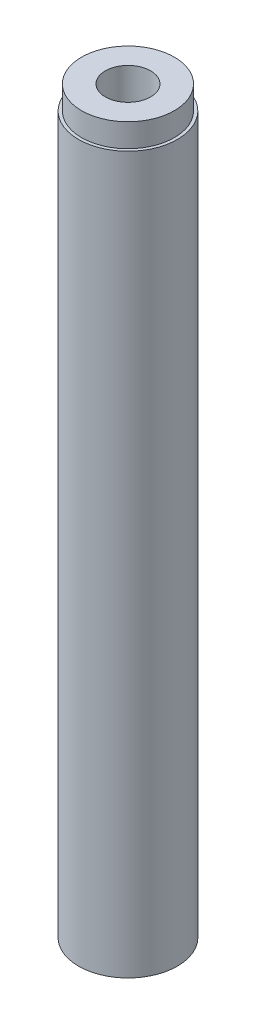
ISO-10303-21;
HEADER;
FILE_DESCRIPTION(('STEP AP214'),'2;1');
FILE_NAME('part.step','',(''),(''),'','','');
FILE_SCHEMA(('AUTOMOTIVE_DESIGN { 1 0 10303 214 1 1 1 1 }'));
ENDSEC;
DATA;
#1=APPLICATION_CONTEXT('core data for automotive mechanical design processes');
#2=APPLICATION_PROTOCOL_DEFINITION('international standard','automotive_design',2000,#1);
#3=PRODUCT_CONTEXT('',#1,'mechanical');
#4=PRODUCT('Part','Part','',(#3));
#5=PRODUCT_RELATED_PRODUCT_CATEGORY('part','',(#4));
#6=PRODUCT_DEFINITION_FORMATION('','',#4);
#7=PRODUCT_DEFINITION_CONTEXT('part definition',#1,'design');
#8=PRODUCT_DEFINITION('design','',#6,#7);
#9=PRODUCT_DEFINITION_SHAPE('','',#8);
#10=(LENGTH_UNIT() NAMED_UNIT(*) SI_UNIT(.MILLI.,.METRE.));
#11=(NAMED_UNIT(*) PLANE_ANGLE_UNIT() SI_UNIT($,.RADIAN.));
#12=(NAMED_UNIT(*) SI_UNIT($,.STERADIAN.) SOLID_ANGLE_UNIT());
#13=UNCERTAINTY_MEASURE_WITH_UNIT(LENGTH_MEASURE(1.E-05),#10,'distance_accuracy_value','');
#14=(GEOMETRIC_REPRESENTATION_CONTEXT(3) GLOBAL_UNCERTAINTY_ASSIGNED_CONTEXT((#13)) GLOBAL_UNIT_ASSIGNED_CONTEXT((#10,
#11,#12)) REPRESENTATION_CONTEXT('',''));
#15=CARTESIAN_POINT('',(0.,0.,0.));
#16=DIRECTION('',(0.,0.,1.));
#17=DIRECTION('',(1.,0.,0.));
#18=AXIS2_PLACEMENT_3D('',#15,#16,#17);
#19=CARTESIAN_POINT('',(0.,98.,0.));
#20=DIRECTION('',(0.,1.,0.));
#21=DIRECTION('',(0.,0.,1.));
#22=AXIS2_PLACEMENT_3D('',#19,#20,#21);
#23=PLANE('',#22);
#24=CARTESIAN_POINT('',(0.,98.,0.));
#25=DIRECTION('',(0.,1.,0.));
#26=DIRECTION('',(0.,0.,1.));
#27=AXIS2_PLACEMENT_3D('',#24,#25,#26);
#28=CIRCLE('',#27,3.);
#29=CARTESIAN_POINT('',(0.,98.,3.));
#30=VERTEX_POINT('',#29);
#31=EDGE_CURVE('E45',#30,#30,#28,.T.);
#32=ORIENTED_EDGE('',*,*,#31,.F.);
#33=EDGE_LOOP('',(#32));
#34=FACE_BOUND('',#33,.T.);
#35=CARTESIAN_POINT('',(0.,98.,0.));
#36=DIRECTION('',(0.,1.,0.));
#37=DIRECTION('',(0.,0.,1.));
#38=AXIS2_PLACEMENT_3D('',#35,#36,#37);
#39=CIRCLE('',#38,6.15);
#40=CARTESIAN_POINT('',(0.,98.,6.15));
#41=VERTEX_POINT('',#40);
#42=EDGE_CURVE('E59',#41,#41,#39,.T.);
#43=ORIENTED_EDGE('',*,*,#42,.T.);
#44=EDGE_LOOP('',(#43));
#45=FACE_BOUND('',#44,.T.);
#46=ADVANCED_FACE('F38',(#34,#45),#23,.T.);
#47=CARTESIAN_POINT('',(0.,98.,0.));
#48=DIRECTION('',(0.,-1.,0.));
#49=DIRECTION('',(0.,0.,-1.));
#50=AXIS2_PLACEMENT_3D('',#47,#48,#49);
#51=CYLINDRICAL_SURFACE('',#50,6.55);
#52=CARTESIAN_POINT('',(0.,0.,0.));
#53=DIRECTION('',(0.,1.,0.));
#54=DIRECTION('',(0.,0.,1.));
#55=AXIS2_PLACEMENT_3D('',#52,#53,#54);
#56=CIRCLE('',#55,6.55);
#57=CARTESIAN_POINT('',(0.,0.,6.55));
#58=VERTEX_POINT('',#57);
#59=EDGE_CURVE('E11',#58,#58,#56,.T.);
#60=ORIENTED_EDGE('',*,*,#59,.T.);
#61=EDGE_LOOP('',(#60));
#62=FACE_BOUND('',#61,.T.);
#63=CARTESIAN_POINT('',(0.,94.9,0.));
#64=DIRECTION('',(0.,1.,0.));
#65=DIRECTION('',(0.,0.,1.));
#66=AXIS2_PLACEMENT_3D('',#63,#64,#65);
#67=CIRCLE('',#66,6.55);
#68=CARTESIAN_POINT('',(0.,94.9,6.55));
#69=VERTEX_POINT('',#68);
#70=EDGE_CURVE('E54',#69,#69,#67,.T.);
#71=ORIENTED_EDGE('',*,*,#70,.F.);
#72=EDGE_LOOP('',(#71));
#73=FACE_BOUND('',#72,.T.);
#74=ADVANCED_FACE('F40',(#62,#73),#51,.T.);
#75=CARTESIAN_POINT('',(0.,0.,0.));
#76=DIRECTION('',(0.,1.,0.));
#77=DIRECTION('',(0.,0.,1.));
#78=AXIS2_PLACEMENT_3D('',#75,#76,#77);
#79=PLANE('',#78);
#80=ORIENTED_EDGE('',*,*,#59,.F.);
#81=EDGE_LOOP('',(#80));
#82=FACE_BOUND('',#81,.T.);
#83=CARTESIAN_POINT('',(0.,0.,0.));
#84=DIRECTION('',(0.,1.,0.));
#85=DIRECTION('',(0.,0.,1.));
#86=AXIS2_PLACEMENT_3D('',#83,#84,#85);
#87=CIRCLE('',#86,3.);
#88=CARTESIAN_POINT('',(0.,0.,3.));
#89=VERTEX_POINT('',#88);
#90=EDGE_CURVE('E49',#89,#89,#87,.T.);
#91=ORIENTED_EDGE('',*,*,#90,.T.);
#92=EDGE_LOOP('',(#91));
#93=FACE_BOUND('',#92,.T.);
#94=ADVANCED_FACE('F76',(#82,#93),#79,.F.);
#95=CARTESIAN_POINT('',(0.,98.,0.));
#96=DIRECTION('',(0.,-1.,0.));
#97=DIRECTION('',(0.,0.,-1.));
#98=AXIS2_PLACEMENT_3D('',#95,#96,#97);
#99=CYLINDRICAL_SURFACE('',#98,3.);
#100=ORIENTED_EDGE('',*,*,#31,.T.);
#101=EDGE_LOOP('',(#100));
#102=FACE_BOUND('',#101,.T.);
#103=ORIENTED_EDGE('',*,*,#90,.F.);
#104=EDGE_LOOP('',(#103));
#105=FACE_BOUND('',#104,.T.);
#106=ADVANCED_FACE('F71',(#102,#105),#99,.F.);
#107=CARTESIAN_POINT('',(0.,94.9,0.));
#108=DIRECTION('',(0.,1.,0.));
#109=DIRECTION('',(0.,0.,1.));
#110=AXIS2_PLACEMENT_3D('',#107,#108,#109);
#111=PLANE('',#110);
#112=CARTESIAN_POINT('',(0.,94.9,0.));
#113=DIRECTION('',(0.,1.,0.));
#114=DIRECTION('',(0.,0.,1.));
#115=AXIS2_PLACEMENT_3D('',#112,#113,#114);
#116=CIRCLE('',#115,6.15);
#117=CARTESIAN_POINT('',(0.,94.9,6.15));
#118=VERTEX_POINT('',#117);
#119=EDGE_CURVE('E58',#118,#118,#116,.T.);
#120=ORIENTED_EDGE('',*,*,#119,.F.);
#121=EDGE_LOOP('',(#120));
#122=FACE_BOUND('',#121,.T.);
#123=ORIENTED_EDGE('',*,*,#70,.T.);
#124=EDGE_LOOP('',(#123));
#125=FACE_BOUND('',#124,.T.);
#126=ADVANCED_FACE('F68',(#122,#125),#111,.T.);
#127=CARTESIAN_POINT('',(0.,94.9,0.));
#128=DIRECTION('',(0.,1.,0.));
#129=DIRECTION('',(0.,0.,1.));
#130=AXIS2_PLACEMENT_3D('',#127,#128,#129);
#131=CYLINDRICAL_SURFACE('',#130,6.15);
#132=CARTESIAN_POINT('',(0.,94.9,6.15));
#133=CARTESIAN_POINT('',(0.,94.9322916666667,6.15));
#134=CARTESIAN_POINT('',(0.,94.9645833333333,6.15));
#135=CARTESIAN_POINT('',(0.,95.0291666666667,6.15));
#136=CARTESIAN_POINT('',(0.,95.0614583333333,6.15));
#137=CARTESIAN_POINT('',(0.,95.1260416666667,6.15));
#138=CARTESIAN_POINT('',(0.,95.1583333333333,6.15));
#139=CARTESIAN_POINT('',(0.,95.2229166666667,6.15));
#140=CARTESIAN_POINT('',(0.,95.2552083333333,6.15));
#141=CARTESIAN_POINT('',(0.,95.3197916666667,6.15));
#142=CARTESIAN_POINT('',(0.,95.3520833333333,6.15));
#143=CARTESIAN_POINT('',(0.,95.4166666666667,6.15));
#144=CARTESIAN_POINT('',(0.,95.4489583333333,6.15));
#145=CARTESIAN_POINT('',(0.,95.5135416666667,6.15));
#146=CARTESIAN_POINT('',(0.,95.5458333333333,6.15));
#147=CARTESIAN_POINT('',(0.,95.6104166666667,6.15));
#148=CARTESIAN_POINT('',(0.,95.6427083333333,6.15));
#149=CARTESIAN_POINT('',(0.,95.7072916666667,6.15));
#150=CARTESIAN_POINT('',(0.,95.7395833333333,6.15));
#151=CARTESIAN_POINT('',(0.,95.8041666666667,6.15));
#152=CARTESIAN_POINT('',(0.,95.8364583333333,6.15));
#153=CARTESIAN_POINT('',(0.,95.9010416666667,6.15));
#154=CARTESIAN_POINT('',(0.,95.9333333333333,6.15));
#155=CARTESIAN_POINT('',(0.,95.9979166666667,6.15));
#156=CARTESIAN_POINT('',(0.,96.0302083333333,6.15));
#157=CARTESIAN_POINT('',(0.,96.0947916666667,6.15));
#158=CARTESIAN_POINT('',(0.,96.1270833333333,6.15));
#159=CARTESIAN_POINT('',(0.,96.1916666666667,6.15));
#160=CARTESIAN_POINT('',(0.,96.2239583333333,6.15));
#161=CARTESIAN_POINT('',(0.,96.2885416666667,6.15));
#162=CARTESIAN_POINT('',(0.,96.3208333333333,6.15));
#163=CARTESIAN_POINT('',(0.,96.3854166666667,6.15));
#164=CARTESIAN_POINT('',(0.,96.4177083333333,6.15));
#165=CARTESIAN_POINT('',(0.,96.4822916666667,6.15));
#166=CARTESIAN_POINT('',(0.,96.5145833333333,6.15));
#167=CARTESIAN_POINT('',(0.,96.5791666666667,6.15));
#168=CARTESIAN_POINT('',(0.,96.6114583333333,6.15));
#169=CARTESIAN_POINT('',(0.,96.6760416666667,6.15));
#170=CARTESIAN_POINT('',(0.,96.7083333333333,6.15));
#171=CARTESIAN_POINT('',(0.,96.7729166666667,6.15));
#172=CARTESIAN_POINT('',(0.,96.8052083333333,6.15));
#173=CARTESIAN_POINT('',(0.,96.8697916666667,6.15));
#174=CARTESIAN_POINT('',(0.,96.9020833333333,6.15));
#175=CARTESIAN_POINT('',(0.,96.9666666666667,6.15));
#176=CARTESIAN_POINT('',(0.,96.9989583333333,6.15));
#177=CARTESIAN_POINT('',(0.,97.0635416666667,6.15));
#178=CARTESIAN_POINT('',(0.,97.0958333333333,6.15));
#179=CARTESIAN_POINT('',(0.,97.1604166666667,6.15));
#180=CARTESIAN_POINT('',(0.,97.1927083333333,6.15));
#181=CARTESIAN_POINT('',(0.,97.2572916666667,6.15));
#182=CARTESIAN_POINT('',(0.,97.2895833333333,6.15));
#183=CARTESIAN_POINT('',(0.,97.3541666666667,6.15));
#184=CARTESIAN_POINT('',(0.,97.3864583333333,6.15));
#185=CARTESIAN_POINT('',(0.,97.4510416666667,6.15));
#186=CARTESIAN_POINT('',(0.,97.4833333333333,6.15));
#187=CARTESIAN_POINT('',(0.,97.5479166666667,6.15));
#188=CARTESIAN_POINT('',(0.,97.5802083333333,6.15));
#189=CARTESIAN_POINT('',(0.,97.6447916666667,6.15));
#190=CARTESIAN_POINT('',(0.,97.6770833333333,6.15));
#191=CARTESIAN_POINT('',(0.,97.7416666666667,6.15));
#192=CARTESIAN_POINT('',(0.,97.7739583333333,6.15));
#193=CARTESIAN_POINT('',(0.,97.8385416666667,6.15));
#194=CARTESIAN_POINT('',(0.,97.8708333333333,6.15));
#195=CARTESIAN_POINT('',(0.,97.9354166666667,6.15));
#196=CARTESIAN_POINT('',(0.,97.9677083333333,6.15));
#197=CARTESIAN_POINT('',(0.,98.,6.15));
#198=B_SPLINE_CURVE_WITH_KNOTS('',3,(#132,#133,#134,#135,#136,#137,#138,#139,#140,#141,#142,
#143,#144,#145,#146,#147,#148,#149,#150,#151,#152,#153,#154,#155,#156,#157,#158,#159,#160,#161,
#162,#163,#164,#165,#166,#167,#168,#169,#170,#171,#172,#173,#174,#175,#176,#177,#178,#179,#180,
#181,#182,#183,#184,#185,#186,#187,#188,#189,#190,#191,#192,#193,#194,#195,#196,#197),
.UNSPECIFIED.,.F.,.F.,(4,2,2,2,2,2,2,2,2,2,2,2,2,2,2,2,2,2,2,2,2,2,2,2,2,2,2,2,2,2,2,2,4),(0.,
0.0968749999999963,0.193749999999993,0.290624999999989,0.387499999999985,0.484374999999995,
0.581249999999991,0.678124999999988,0.774999999999984,0.871874999999994,0.96874999999999,
1.06562499999999,1.16249999999998,1.25937499999999,1.35624999999999,1.45312499999999,
1.54999999999998,1.64687499999999,1.74374999999999,1.84062499999998,1.93749999999998,
2.03437499999999,2.13124999999999,2.22812499999998,2.32499999999998,2.42187499999999,
2.51874999999999,2.61562499999998,2.71249999999998,2.80937499999999,2.90624999999999,
3.00312499999998,3.09999999999998),.UNSPECIFIED.);
#199=EDGE_CURVE('BSEAM65',#118,#41,#198,.T.);
#200=ORIENTED_EDGE('',*,*,#119,.T.);
#201=ORIENTED_EDGE('',*,*,#42,.F.);
#202=ORIENTED_EDGE('',*,*,#199,.T.);
#203=ORIENTED_EDGE('',*,*,#199,.F.);
#204=EDGE_LOOP('',(#200,#202,#201,#203));
#205=FACE_BOUND('',#204,.T.);
#206=ADVANCED_FACE('F65',(#205),#131,.T.);
#207=CLOSED_SHELL('',(#46,#74,#94,#106,#126,#206));
#208=MANIFOLD_SOLID_BREP('B2',#207);
#209=ADVANCED_BREP_SHAPE_REPRESENTATION('',(#18,#208),#14);
#210=SHAPE_DEFINITION_REPRESENTATION(#9,#209);
ENDSEC;
END-ISO-10303-21;
